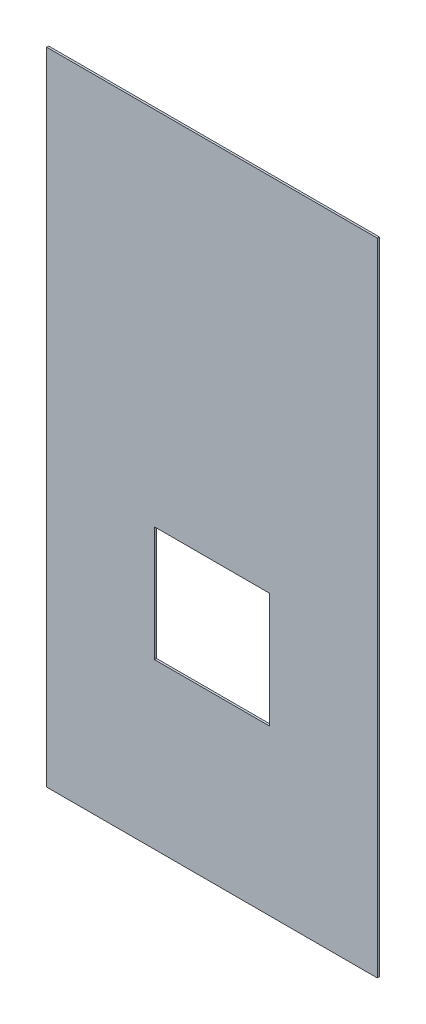
ISO-10303-21;
HEADER;
FILE_DESCRIPTION(('STEP AP214'),'2;1');
FILE_NAME('part.step','',(''),(''),'','','');
FILE_SCHEMA(('AUTOMOTIVE_DESIGN { 1 0 10303 214 1 1 1 1 }'));
ENDSEC;
DATA;
#1=APPLICATION_CONTEXT('core data for automotive mechanical design processes');
#2=APPLICATION_PROTOCOL_DEFINITION('international standard','automotive_design',2000,#1);
#3=PRODUCT_CONTEXT('',#1,'mechanical');
#4=PRODUCT('Part','Part','',(#3));
#5=PRODUCT_RELATED_PRODUCT_CATEGORY('part','',(#4));
#6=PRODUCT_DEFINITION_FORMATION('','',#4);
#7=PRODUCT_DEFINITION_CONTEXT('part definition',#1,'design');
#8=PRODUCT_DEFINITION('design','',#6,#7);
#9=PRODUCT_DEFINITION_SHAPE('','',#8);
#10=(LENGTH_UNIT() NAMED_UNIT(*) SI_UNIT(.MILLI.,.METRE.));
#11=(NAMED_UNIT(*) PLANE_ANGLE_UNIT() SI_UNIT($,.RADIAN.));
#12=(NAMED_UNIT(*) SI_UNIT($,.STERADIAN.) SOLID_ANGLE_UNIT());
#13=UNCERTAINTY_MEASURE_WITH_UNIT(LENGTH_MEASURE(1.E-05),#10,'distance_accuracy_value','');
#14=(GEOMETRIC_REPRESENTATION_CONTEXT(3) GLOBAL_UNCERTAINTY_ASSIGNED_CONTEXT((#13)) GLOBAL_UNIT_ASSIGNED_CONTEXT((#10,
#11,#12)) REPRESENTATION_CONTEXT('',''));
#15=CARTESIAN_POINT('',(0.,0.,0.));
#16=DIRECTION('',(0.,0.,1.));
#17=DIRECTION('',(1.,0.,0.));
#18=AXIS2_PLACEMENT_3D('',#15,#16,#17);
#19=CARTESIAN_POINT('',(0.,0.,6.35));
#20=DIRECTION('',(0.,0.,-1.));
#21=DIRECTION('',(-1.,0.,0.));
#22=AXIS2_PLACEMENT_3D('',#19,#20,#21);
#23=PLANE('',#22);
#24=DIRECTION('',(0.,-1.,0.));
#25=VECTOR('',#24,1.);
#26=CARTESIAN_POINT('',(0.,0.,6.35));
#27=LINE('',#26,#25);
#28=CARTESIAN_POINT('',(0.,1981.2,6.35));
#29=VERTEX_POINT('',#28);
#30=CARTESIAN_POINT('',(0.,0.,6.35));
#31=VERTEX_POINT('',#30);
#32=EDGE_CURVE('E134',#29,#31,#27,.T.);
#33=ORIENTED_EDGE('',*,*,#32,.T.);
#34=DIRECTION('',(1.,0.,0.));
#35=VECTOR('',#34,1.);
#36=CARTESIAN_POINT('',(0.,0.,6.35));
#37=LINE('',#36,#35);
#38=CARTESIAN_POINT('',(1022.35,0.,6.35));
#39=VERTEX_POINT('',#38);
#40=EDGE_CURVE('E137',#31,#39,#37,.T.);
#41=ORIENTED_EDGE('',*,*,#40,.T.);
#42=DIRECTION('',(0.,1.,0.));
#43=VECTOR('',#42,1.);
#44=CARTESIAN_POINT('',(1022.35,0.,6.35));
#45=LINE('',#44,#43);
#46=CARTESIAN_POINT('',(1022.35,1981.2,6.35));
#47=VERTEX_POINT('',#46);
#48=EDGE_CURVE('E140',#39,#47,#45,.T.);
#49=ORIENTED_EDGE('',*,*,#48,.T.);
#50=DIRECTION('',(-1.,0.,0.));
#51=VECTOR('',#50,1.);
#52=CARTESIAN_POINT('',(0.,1981.2,6.35));
#53=LINE('',#52,#51);
#54=EDGE_CURVE('E142',#47,#29,#53,.T.);
#55=ORIENTED_EDGE('',*,*,#54,.T.);
#56=EDGE_LOOP('',(#33,#41,#49,#55));
#57=FACE_BOUND('',#56,.T.);
#58=DIRECTION('',(0.,-1.,0.));
#59=VECTOR('',#58,1.);
#60=CARTESIAN_POINT('',(333.248,863.6,6.35));
#61=LINE('',#60,#59);
#62=CARTESIAN_POINT('',(333.248,863.6,6.35));
#63=VERTEX_POINT('',#62);
#64=CARTESIAN_POINT('',(333.248,508.,6.35));
#65=VERTEX_POINT('',#64);
#66=EDGE_CURVE('E98',#63,#65,#61,.T.);
#67=ORIENTED_EDGE('',*,*,#66,.F.);
#68=DIRECTION('',(-1.,0.,0.));
#69=VECTOR('',#68,1.);
#70=CARTESIAN_POINT('',(333.248,863.6,6.35));
#71=LINE('',#70,#69);
#72=CARTESIAN_POINT('',(688.848,863.6,6.35));
#73=VERTEX_POINT('',#72);
#74=EDGE_CURVE('E120',#73,#63,#71,.T.);
#75=ORIENTED_EDGE('',*,*,#74,.F.);
#76=DIRECTION('',(0.,1.,0.));
#77=VECTOR('',#76,1.);
#78=CARTESIAN_POINT('',(688.848,863.6,6.35));
#79=LINE('',#78,#77);
#80=CARTESIAN_POINT('',(688.848,508.,6.35));
#81=VERTEX_POINT('',#80);
#82=EDGE_CURVE('E118',#81,#73,#79,.T.);
#83=ORIENTED_EDGE('',*,*,#82,.F.);
#84=DIRECTION('',(1.,0.,0.));
#85=VECTOR('',#84,1.);
#86=CARTESIAN_POINT('',(333.248,508.,6.35));
#87=LINE('',#86,#85);
#88=EDGE_CURVE('E106',#65,#81,#87,.T.);
#89=ORIENTED_EDGE('',*,*,#88,.F.);
#90=EDGE_LOOP('',(#67,#75,#83,#89));
#91=FACE_BOUND('',#90,.T.);
#92=ADVANCED_FACE('F33',(#57,#91),#23,.F.);
#93=CARTESIAN_POINT('',(0.,0.,0.));
#94=DIRECTION('',(0.,0.,-1.));
#95=DIRECTION('',(-1.,0.,0.));
#96=AXIS2_PLACEMENT_3D('',#93,#94,#95);
#97=PLANE('',#96);
#98=DIRECTION('',(0.,-1.,0.));
#99=VECTOR('',#98,1.);
#100=CARTESIAN_POINT('',(0.,0.,0.));
#101=LINE('',#100,#99);
#102=CARTESIAN_POINT('',(0.,1981.2,0.));
#103=VERTEX_POINT('',#102);
#104=CARTESIAN_POINT('',(0.,0.,0.));
#105=VERTEX_POINT('',#104);
#106=EDGE_CURVE('E114',#103,#105,#101,.T.);
#107=ORIENTED_EDGE('',*,*,#106,.F.);
#108=DIRECTION('',(-1.,0.,0.));
#109=VECTOR('',#108,1.);
#110=CARTESIAN_POINT('',(0.,1981.2,0.));
#111=LINE('',#110,#109);
#112=CARTESIAN_POINT('',(1022.35,1981.2,0.));
#113=VERTEX_POINT('',#112);
#114=EDGE_CURVE('E138',#113,#103,#111,.T.);
#115=ORIENTED_EDGE('',*,*,#114,.F.);
#116=DIRECTION('',(0.,1.,0.));
#117=VECTOR('',#116,1.);
#118=CARTESIAN_POINT('',(1022.35,0.,0.));
#119=LINE('',#118,#117);
#120=CARTESIAN_POINT('',(1022.35,0.,0.));
#121=VERTEX_POINT('',#120);
#122=EDGE_CURVE('E149',#121,#113,#119,.T.);
#123=ORIENTED_EDGE('',*,*,#122,.F.);
#124=DIRECTION('',(1.,0.,0.));
#125=VECTOR('',#124,1.);
#126=CARTESIAN_POINT('',(0.,0.,0.));
#127=LINE('',#126,#125);
#128=EDGE_CURVE('E147',#105,#121,#127,.T.);
#129=ORIENTED_EDGE('',*,*,#128,.F.);
#130=EDGE_LOOP('',(#107,#115,#123,#129));
#131=FACE_BOUND('',#130,.T.);
#132=DIRECTION('',(-1.,0.,0.));
#133=VECTOR('',#132,1.);
#134=CARTESIAN_POINT('',(333.248,863.6,0.));
#135=LINE('',#134,#133);
#136=CARTESIAN_POINT('',(688.848,863.6,0.));
#137=VERTEX_POINT('',#136);
#138=CARTESIAN_POINT('',(333.248,863.6,0.));
#139=VERTEX_POINT('',#138);
#140=EDGE_CURVE('E107',#137,#139,#135,.T.);
#141=ORIENTED_EDGE('',*,*,#140,.T.);
#142=DIRECTION('',(0.,-1.,0.));
#143=VECTOR('',#142,1.);
#144=CARTESIAN_POINT('',(333.248,863.6,0.));
#145=LINE('',#144,#143);
#146=CARTESIAN_POINT('',(333.248,508.,0.));
#147=VERTEX_POINT('',#146);
#148=EDGE_CURVE('E56',#139,#147,#145,.T.);
#149=ORIENTED_EDGE('',*,*,#148,.T.);
#150=DIRECTION('',(1.,0.,0.));
#151=VECTOR('',#150,1.);
#152=CARTESIAN_POINT('',(333.248,508.,0.));
#153=LINE('',#152,#151);
#154=CARTESIAN_POINT('',(688.848,508.,0.));
#155=VERTEX_POINT('',#154);
#156=EDGE_CURVE('E113',#147,#155,#153,.T.);
#157=ORIENTED_EDGE('',*,*,#156,.T.);
#158=DIRECTION('',(0.,1.,0.));
#159=VECTOR('',#158,1.);
#160=CARTESIAN_POINT('',(688.848,863.6,0.));
#161=LINE('',#160,#159);
#162=EDGE_CURVE('E126',#155,#137,#161,.T.);
#163=ORIENTED_EDGE('',*,*,#162,.T.);
#164=EDGE_LOOP('',(#141,#149,#157,#163));
#165=FACE_BOUND('',#164,.T.);
#166=ADVANCED_FACE('F167',(#131,#165),#97,.T.);
#167=CARTESIAN_POINT('',(0.,0.,6.35));
#168=DIRECTION('',(1.,0.,0.));
#169=DIRECTION('',(0.,0.,-1.));
#170=AXIS2_PLACEMENT_3D('',#167,#168,#169);
#171=PLANE('',#170);
#172=ORIENTED_EDGE('',*,*,#106,.T.);
#173=DIRECTION('',(0.,0.,-1.));
#174=VECTOR('',#173,1.);
#175=CARTESIAN_POINT('',(0.,0.,6.35));
#176=LINE('',#175,#174);
#177=EDGE_CURVE('E11',#31,#105,#176,.T.);
#178=ORIENTED_EDGE('',*,*,#177,.F.);
#179=ORIENTED_EDGE('',*,*,#32,.F.);
#180=DIRECTION('',(0.,0.,-1.));
#181=VECTOR('',#180,1.);
#182=CARTESIAN_POINT('',(0.,1981.2,6.35));
#183=LINE('',#182,#181);
#184=EDGE_CURVE('E144',#29,#103,#183,.T.);
#185=ORIENTED_EDGE('',*,*,#184,.T.);
#186=EDGE_LOOP('',(#172,#178,#179,#185));
#187=FACE_BOUND('',#186,.T.);
#188=ADVANCED_FACE('F35',(#187),#171,.F.);
#189=CARTESIAN_POINT('',(0.,0.,6.35));
#190=DIRECTION('',(0.,1.,0.));
#191=DIRECTION('',(0.,0.,1.));
#192=AXIS2_PLACEMENT_3D('',#189,#190,#191);
#193=PLANE('',#192);
#194=ORIENTED_EDGE('',*,*,#128,.T.);
#195=DIRECTION('',(0.,0.,-1.));
#196=VECTOR('',#195,1.);
#197=CARTESIAN_POINT('',(1022.35,0.,6.35));
#198=LINE('',#197,#196);
#199=EDGE_CURVE('E41',#39,#121,#198,.T.);
#200=ORIENTED_EDGE('',*,*,#199,.F.);
#201=ORIENTED_EDGE('',*,*,#40,.F.);
#202=ORIENTED_EDGE('',*,*,#177,.T.);
#203=EDGE_LOOP('',(#194,#200,#201,#202));
#204=FACE_BOUND('',#203,.T.);
#205=ADVANCED_FACE('F177',(#204),#193,.F.);
#206=CARTESIAN_POINT('',(1022.35,0.,6.35));
#207=DIRECTION('',(-1.,0.,0.));
#208=DIRECTION('',(0.,0.,1.));
#209=AXIS2_PLACEMENT_3D('',#206,#207,#208);
#210=PLANE('',#209);
#211=ORIENTED_EDGE('',*,*,#122,.T.);
#212=DIRECTION('',(0.,0.,-1.));
#213=VECTOR('',#212,1.);
#214=CARTESIAN_POINT('',(1022.35,1981.2,6.35));
#215=LINE('',#214,#213);
#216=EDGE_CURVE('E154',#47,#113,#215,.T.);
#217=ORIENTED_EDGE('',*,*,#216,.F.);
#218=ORIENTED_EDGE('',*,*,#48,.F.);
#219=ORIENTED_EDGE('',*,*,#199,.T.);
#220=EDGE_LOOP('',(#211,#217,#218,#219));
#221=FACE_BOUND('',#220,.T.);
#222=ADVANCED_FACE('F161',(#221),#210,.F.);
#223=CARTESIAN_POINT('',(0.,1981.2,6.35));
#224=DIRECTION('',(0.,-1.,0.));
#225=DIRECTION('',(0.,0.,-1.));
#226=AXIS2_PLACEMENT_3D('',#223,#224,#225);
#227=PLANE('',#226);
#228=ORIENTED_EDGE('',*,*,#114,.T.);
#229=ORIENTED_EDGE('',*,*,#184,.F.);
#230=ORIENTED_EDGE('',*,*,#54,.F.);
#231=ORIENTED_EDGE('',*,*,#216,.T.);
#232=EDGE_LOOP('',(#228,#229,#230,#231));
#233=FACE_BOUND('',#232,.T.);
#234=ADVANCED_FACE('F171',(#233),#227,.F.);
#235=CARTESIAN_POINT('',(333.248,863.6,6.35));
#236=DIRECTION('',(1.,0.,0.));
#237=DIRECTION('',(0.,1.,0.));
#238=AXIS2_PLACEMENT_3D('',#235,#236,#237);
#239=PLANE('',#238);
#240=ORIENTED_EDGE('',*,*,#148,.F.);
#241=DIRECTION('',(0.,0.,-1.));
#242=VECTOR('',#241,1.);
#243=CARTESIAN_POINT('',(333.248,863.6,6.35));
#244=LINE('',#243,#242);
#245=EDGE_CURVE('E102',#63,#139,#244,.T.);
#246=ORIENTED_EDGE('',*,*,#245,.F.);
#247=ORIENTED_EDGE('',*,*,#66,.T.);
#248=DIRECTION('',(0.,0.,-1.));
#249=VECTOR('',#248,1.);
#250=CARTESIAN_POINT('',(333.248,508.,6.35));
#251=LINE('',#250,#249);
#252=EDGE_CURVE('E101',#65,#147,#251,.T.);
#253=ORIENTED_EDGE('',*,*,#252,.T.);
#254=EDGE_LOOP('',(#240,#246,#247,#253));
#255=FACE_BOUND('',#254,.T.);
#256=ADVANCED_FACE('F100',(#255),#239,.T.);
#257=CARTESIAN_POINT('',(333.248,508.,6.35));
#258=DIRECTION('',(0.,1.,0.));
#259=DIRECTION('',(0.,0.,1.));
#260=AXIS2_PLACEMENT_3D('',#257,#258,#259);
#261=PLANE('',#260);
#262=ORIENTED_EDGE('',*,*,#156,.F.);
#263=ORIENTED_EDGE('',*,*,#252,.F.);
#264=ORIENTED_EDGE('',*,*,#88,.T.);
#265=DIRECTION('',(0.,0.,-1.));
#266=VECTOR('',#265,1.);
#267=CARTESIAN_POINT('',(688.848,508.,6.35));
#268=LINE('',#267,#266);
#269=EDGE_CURVE('E115',#81,#155,#268,.T.);
#270=ORIENTED_EDGE('',*,*,#269,.T.);
#271=EDGE_LOOP('',(#262,#263,#264,#270));
#272=FACE_BOUND('',#271,.T.);
#273=ADVANCED_FACE('F110',(#272),#261,.T.);
#274=CARTESIAN_POINT('',(688.848,863.6,6.35));
#275=DIRECTION('',(-1.,0.,0.));
#276=DIRECTION('',(0.,0.,1.));
#277=AXIS2_PLACEMENT_3D('',#274,#275,#276);
#278=PLANE('',#277);
#279=ORIENTED_EDGE('',*,*,#162,.F.);
#280=ORIENTED_EDGE('',*,*,#269,.F.);
#281=ORIENTED_EDGE('',*,*,#82,.T.);
#282=DIRECTION('',(0.,0.,-1.));
#283=VECTOR('',#282,1.);
#284=CARTESIAN_POINT('',(688.848,863.6,6.35));
#285=LINE('',#284,#283);
#286=EDGE_CURVE('E48',#73,#137,#285,.T.);
#287=ORIENTED_EDGE('',*,*,#286,.T.);
#288=EDGE_LOOP('',(#279,#280,#281,#287));
#289=FACE_BOUND('',#288,.T.);
#290=ADVANCED_FACE('F200',(#289),#278,.T.);
#291=CARTESIAN_POINT('',(333.248,863.6,6.35));
#292=DIRECTION('',(0.,-1.,0.));
#293=DIRECTION('',(0.,0.,-1.));
#294=AXIS2_PLACEMENT_3D('',#291,#292,#293);
#295=PLANE('',#294);
#296=ORIENTED_EDGE('',*,*,#140,.F.);
#297=ORIENTED_EDGE('',*,*,#286,.F.);
#298=ORIENTED_EDGE('',*,*,#74,.T.);
#299=ORIENTED_EDGE('',*,*,#245,.T.);
#300=EDGE_LOOP('',(#296,#297,#298,#299));
#301=FACE_BOUND('',#300,.T.);
#302=ADVANCED_FACE('F204',(#301),#295,.T.);
#303=CLOSED_SHELL('',(#92,#166,#188,#205,#222,#234,#256,#273,#290,#302));
#304=MANIFOLD_SOLID_BREP('B2',#303);
#305=ADVANCED_BREP_SHAPE_REPRESENTATION('',(#18,#304),#14);
#306=SHAPE_DEFINITION_REPRESENTATION(#9,#305);
ENDSEC;
END-ISO-10303-21;
